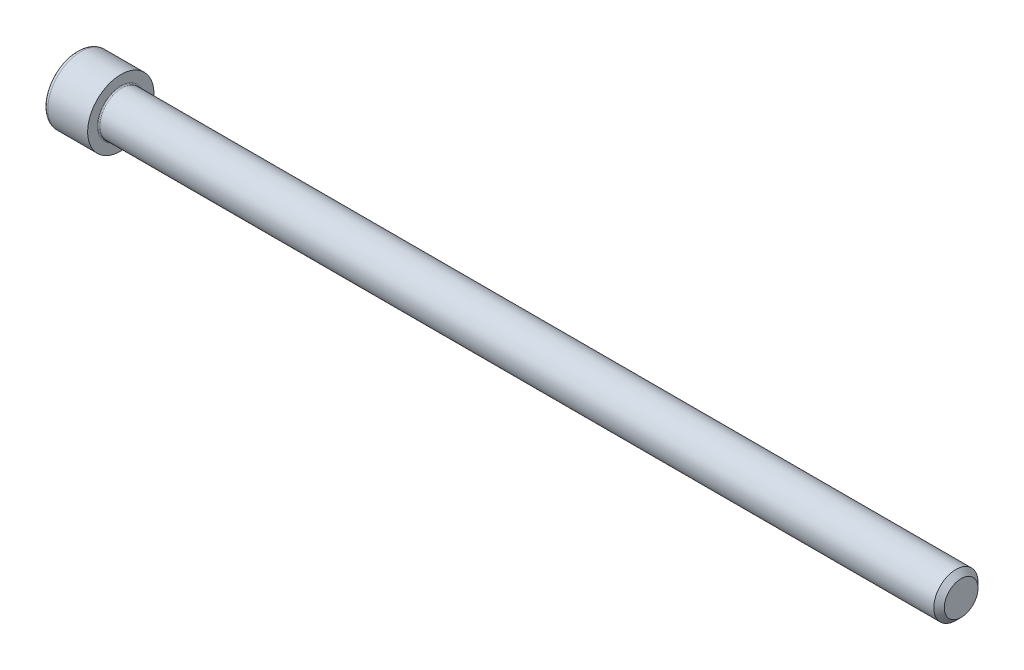
ISO-10303-21;
HEADER;
FILE_DESCRIPTION(('STEP AP214'),'2;1');
FILE_NAME('part.step','',(''),(''),'','','');
FILE_SCHEMA(('AUTOMOTIVE_DESIGN { 1 0 10303 214 1 1 1 1 }'));
ENDSEC;
DATA;
#1=APPLICATION_CONTEXT('core data for automotive mechanical design processes');
#2=APPLICATION_PROTOCOL_DEFINITION('international standard','automotive_design',2000,#1);
#3=PRODUCT_CONTEXT('',#1,'mechanical');
#4=PRODUCT('Part','Part','',(#3));
#5=PRODUCT_RELATED_PRODUCT_CATEGORY('part','',(#4));
#6=PRODUCT_DEFINITION_FORMATION('','',#4);
#7=PRODUCT_DEFINITION_CONTEXT('part definition',#1,'design');
#8=PRODUCT_DEFINITION('design','',#6,#7);
#9=PRODUCT_DEFINITION_SHAPE('','',#8);
#10=(LENGTH_UNIT() NAMED_UNIT(*) SI_UNIT(.MILLI.,.METRE.));
#11=(NAMED_UNIT(*) PLANE_ANGLE_UNIT() SI_UNIT($,.RADIAN.));
#12=(NAMED_UNIT(*) SI_UNIT($,.STERADIAN.) SOLID_ANGLE_UNIT());
#13=UNCERTAINTY_MEASURE_WITH_UNIT(LENGTH_MEASURE(1.E-05),#10,'distance_accuracy_value','');
#14=(GEOMETRIC_REPRESENTATION_CONTEXT(3) GLOBAL_UNCERTAINTY_ASSIGNED_CONTEXT((#13)) GLOBAL_UNIT_ASSIGNED_CONTEXT((#10,
#11,#12)) REPRESENTATION_CONTEXT('',''));
#15=CARTESIAN_POINT('',(0.,0.,0.));
#16=DIRECTION('',(0.,0.,1.));
#17=DIRECTION('',(1.,0.,0.));
#18=AXIS2_PLACEMENT_3D('',#15,#16,#17);
#19=CARTESIAN_POINT('',(-3.302,0.,0.));
#20=DIRECTION('',(-1.,0.,0.));
#21=DIRECTION('',(0.,-1.,0.));
#22=AXIS2_PLACEMENT_3D('',#19,#20,#21);
#23=CONICAL_SURFACE('',#22,2.7569630054343,1.0471975511966);
#24=CARTESIAN_POINT('',(-1.71026666666666,0.,0.));
#25=VERTEX_POINT('',#24);
#26=VERTEX_LOOP('',#25);
#27=FACE_BOUND('',#26,.T.);
#28=CARTESIAN_POINT('',(-3.30206667085494,0.000200000000433414,2.75707847548839));
#29=CARTESIAN_POINT('',(-3.26707753696983,-0.104723935463937,2.6965006131036));
#30=CARTESIAN_POINT('',(-3.2352559146133,-0.210553565393113,2.63539984777575));
#31=CARTESIAN_POINT('',(-3.17971030909145,-0.424045469620166,2.51214023940046));
#32=CARTESIAN_POINT('',(-3.15600597703146,-0.5317115380593,2.44997920580453));
#33=CARTESIAN_POINT('',(-3.11910584905482,-0.745709321959359,2.32642752766385));
#34=CARTESIAN_POINT('',(-3.10566447822797,-0.852008106597724,2.26505589573836));
#35=CARTESIAN_POINT('',(-3.08961674760199,-1.0651059825394,2.1420237796997));
#36=CARTESIAN_POINT('',(-3.08699710051457,-1.17190429901672,2.08036374293251));
#37=CARTESIAN_POINT('',(-3.09243976092168,-1.3714718573095,1.96514335943066));
#38=CARTESIAN_POINT('',(-3.09916570852556,-1.46427093659275,1.91156578602593));
#39=CARTESIAN_POINT('',(-3.1204852251421,-1.64926449459375,1.80475970551571));
#40=CARTESIAN_POINT('',(-3.13508608064024,-1.74145833320265,1.75153156797723));
#41=CARTESIAN_POINT('',(-3.1715879595363,-1.92683347580797,1.64450517949299));
#42=CARTESIAN_POINT('',(-3.19364375098414,-2.0199913112977,1.59072047809587));
#43=CARTESIAN_POINT('',(-3.24370205803596,-2.20491735878384,1.48395337479957));
#44=CARTESIAN_POINT('',(-3.27169280762564,-2.29668794093022,1.43096960449367));
#45=CARTESIAN_POINT('',(-3.30206667085479,-2.3878,1.37836603266331));
#46=B_SPLINE_CURVE_WITH_KNOTS('',3,(#28,#29,#30,#31,#32,#33,#34,#35,#36,#37,#38,#39,#40,#41,#42,
#43,#44,#45),.UNSPECIFIED.,.F.,.F.,(4,2,2,2,2,2,2,2,4),(0.,0.378469527554682,0.757848917720178,
1.12783830118156,1.49737326355518,1.81916504067634,2.14125507699924,2.4704906802841,
2.7990795790434),.UNSPECIFIED.);
#47=CARTESIAN_POINT('',(-3.30200000001923,0.,2.7569630054343));
#48=VERTEX_POINT('',#47);
#49=CARTESIAN_POINT('',(-3.30200000001923,-2.3876,1.37848150271715));
#50=VERTEX_POINT('',#49);
#51=EDGE_CURVE('E132',#48,#50,#46,.T.);
#52=ORIENTED_EDGE('',*,*,#51,.F.);
#53=CARTESIAN_POINT('',(-3.30206667085494,2.38780000000044,1.37836603266306));
#54=CARTESIAN_POINT('',(-3.26707753696983,2.28287606453606,1.43894389504785));
#55=CARTESIAN_POINT('',(-3.2352559146133,2.17704643460689,1.5000446603757));
#56=CARTESIAN_POINT('',(-3.17971030909145,1.96355453037984,1.62330426875099));
#57=CARTESIAN_POINT('',(-3.15600597703146,1.8558884619407,1.68546530234691));
#58=CARTESIAN_POINT('',(-3.11910584905482,1.64189067804064,1.8090169804876));
#59=CARTESIAN_POINT('',(-3.10566447822797,1.53559189340228,1.87038861241309));
#60=CARTESIAN_POINT('',(-3.08961674760199,1.3224940174606,1.99342072845175));
#61=CARTESIAN_POINT('',(-3.08699710051457,1.21569570098328,2.05508076521893));
#62=CARTESIAN_POINT('',(-3.09243976092168,1.0161281426905,2.17030114872078));
#63=CARTESIAN_POINT('',(-3.09916570852556,0.923329063407248,2.22387872212552));
#64=CARTESIAN_POINT('',(-3.1204852251421,0.738335505406253,2.33068480263574));
#65=CARTESIAN_POINT('',(-3.13508608064024,0.646141666797352,2.38391294017421));
#66=CARTESIAN_POINT('',(-3.1715879595363,0.460766524192034,2.49093932865846));
#67=CARTESIAN_POINT('',(-3.19364375098414,0.367608688702303,2.54472403005558));
#68=CARTESIAN_POINT('',(-3.24370205803596,0.182682641216162,2.65149113335188));
#69=CARTESIAN_POINT('',(-3.27169280762564,0.0909120590697815,2.70447490365778));
#70=CARTESIAN_POINT('',(-3.30206667085479,-0.000199999999999891,2.75707847548814));
#71=B_SPLINE_CURVE_WITH_KNOTS('',3,(#53,#54,#55,#56,#57,#58,#59,#60,#61,#62,#63,#64,#65,#66,#67,
#68,#69,#70),.UNSPECIFIED.,.F.,.F.,(4,2,2,2,2,2,2,2,4),(0.,0.378469527554682,0.757848917720177,
1.12783830118156,1.49737326355518,1.81916504067634,2.14125507699925,2.4704906802841,
2.7990795790434),.UNSPECIFIED.);
#72=CARTESIAN_POINT('',(-3.30200000001923,2.3876,1.37848150271715));
#73=VERTEX_POINT('',#72);
#74=EDGE_CURVE('E116',#73,#48,#71,.T.);
#75=ORIENTED_EDGE('',*,*,#74,.F.);
#76=CARTESIAN_POINT('',(-4.18979393601053,2.3876,-3.56980849321914));
#77=CARTESIAN_POINT('',(-4.14032815892821,2.3876,-3.46670370248886));
#78=CARTESIAN_POINT('',(-4.09137617294275,2.3876,-3.36334773439771));
#79=CARTESIAN_POINT('',(-3.99479124822564,2.3876,-3.15599957257145));
#80=CARTESIAN_POINT('',(-3.94715854687755,2.3876,-3.05200726839555));
#81=CARTESIAN_POINT('',(-3.85323755548223,2.3876,-2.84265630190437));
#82=CARTESIAN_POINT('',(-3.80695917341202,2.3876,-2.73729317779474));
#83=CARTESIAN_POINT('',(-3.71647764771049,2.3876,-2.52568279122073));
#84=CARTESIAN_POINT('',(-3.67227439617583,2.3876,-2.41943557506662));
#85=CARTESIAN_POINT('',(-3.58537011973026,2.3876,-2.20308925723331));
#86=CARTESIAN_POINT('',(-3.54273858869362,2.3876,-2.09296207559752));
#87=CARTESIAN_POINT('',(-3.46101994745047,2.3876,-1.87137563995219));
#88=CARTESIAN_POINT('',(-3.42193324834409,2.3876,-1.75991623313437));
#89=CARTESIAN_POINT('',(-3.34842202238522,2.3876,-1.53574546818941));
#90=CARTESIAN_POINT('',(-3.3139867136315,2.3876,-1.42303768420965));
#91=CARTESIAN_POINT('',(-3.2509559036791,2.3876,-1.19600683622335));
#92=CARTESIAN_POINT('',(-3.22235895212225,2.3876,-1.08168418094485));
#93=CARTESIAN_POINT('',(-3.17252928890006,2.3876,-0.851661734027278));
#94=CARTESIAN_POINT('',(-3.15128145205012,2.3876,-0.735965283877569));
#95=CARTESIAN_POINT('',(-3.11754136315291,2.3876,-0.503277987562836));
#96=CARTESIAN_POINT('',(-3.10504851942715,2.3876,-0.386287229412427));
#97=CARTESIAN_POINT('',(-3.08997750794679,2.3876,-0.153060820709615));
#98=CARTESIAN_POINT('',(-3.08728234032656,2.3876,-0.0368329177291767));
#99=CARTESIAN_POINT('',(-3.09173437046107,2.3876,0.195441211734909));
#100=CARTESIAN_POINT('',(-3.09888217765583,2.3876,0.311487426523711));
#101=CARTESIAN_POINT('',(-3.11929953408256,2.3876,0.512427197188799));
#102=CARTESIAN_POINT('',(-3.13048322640562,2.3876,0.597542928135908));
#103=CARTESIAN_POINT('',(-3.15737658155533,2.3876,0.767062617315265));
#104=CARTESIAN_POINT('',(-3.17308702751811,2.3876,0.851466449785063));
#105=CARTESIAN_POINT('',(-3.22617759497026,2.3876,1.10356659989914));
#106=CARTESIAN_POINT('',(-3.26950195890938,2.3876,1.27002026330531));
#107=CARTESIAN_POINT('',(-3.34351951443674,2.3876,1.51891846693128));
#108=CARTESIAN_POINT('',(-3.37004247651048,2.3876,1.60267504477746));
#109=CARTESIAN_POINT('',(-3.42554115129613,2.3876,1.76932116385019));
#110=CARTESIAN_POINT('',(-3.45451533329899,2.3876,1.85221121038454));
#111=CARTESIAN_POINT('',(-3.51449661718129,2.3876,2.01722886079908));
#112=CARTESIAN_POINT('',(-3.54550334960868,2.3876,2.09935660016092));
#113=CARTESIAN_POINT('',(-3.60921387627046,2.3876,2.26296537207273));
#114=CARTESIAN_POINT('',(-3.64191795723009,2.3876,2.34444629266072));
#115=CARTESIAN_POINT('',(-3.72749222624701,2.3876,2.55242893230761));
#116=CARTESIAN_POINT('',(-3.78137257985246,2.3876,2.67851448309363));
#117=CARTESIAN_POINT('',(-3.8917254000684,2.3876,2.92954963732602));
#118=CARTESIAN_POINT('',(-3.94819806086299,2.3876,3.05449915483192));
#119=CARTESIAN_POINT('',(-4.06314681218863,2.3876,3.30349712860239));
#120=CARTESIAN_POINT('',(-4.12162325025623,2.3876,3.42754542399003));
#121=CARTESIAN_POINT('',(-4.24013780231263,2.3876,3.6748949368526));
#122=CARTESIAN_POINT('',(-4.30017595103082,2.3876,3.7981961376383));
#123=CARTESIAN_POINT('',(-4.48227324944979,2.3876,4.16748745488008));
#124=CARTESIAN_POINT('',(-4.60617582250528,2.3876,4.41256771633377));
#125=CARTESIAN_POINT('',(-4.85714973382895,2.3876,4.90105019175774));
#126=CARTESIAN_POINT('',(-4.98422066930818,2.3876,5.14445261405767));
#127=CARTESIAN_POINT('',(-5.22846408211094,2.38760000000001,5.60717601476413));
#128=CARTESIAN_POINT('',(-5.34543879972904,2.38760000000001,5.82660154635426));
#129=CARTESIAN_POINT('',(-5.58072000325182,2.38760000000001,6.26474684956248));
#130=CARTESIAN_POINT('',(-5.69902653844135,2.38760000000001,6.48346659467455));
#131=CARTESIAN_POINT('',(-5.93633623854323,2.38760000000001,6.91980663495285));
#132=CARTESIAN_POINT('',(-6.05533686617889,2.38760000000001,7.13742831158591));
#133=CARTESIAN_POINT('',(-6.29411264362597,2.38760000000001,7.57223168560479));
#134=CARTESIAN_POINT('',(-6.41388775257905,2.38760000000001,7.78941340541968));
#135=CARTESIAN_POINT('',(-6.53394673725325,2.38760000000001,8.00643706714308));
#136=B_SPLINE_CURVE_WITH_KNOTS('',3,(#76,#77,#78,#79,#80,#81,#82,#83,#84,#85,#86,#87,#88,#89,
#90,#91,#92,#93,#94,#95,#96,#97,#98,#99,#100,#101,#102,#103,#104,#105,#106,#107,#108,#109,#110,
#111,#112,#113,#114,#115,#116,#117,#118,#119,#120,#121,#122,#123,#124,#125,#126,#127,#128,#129,
#130,#131,#132,#133,#134,#135),.UNSPECIFIED.,.F.,.F.,(4,2,2,2,2,2,2,2,2,2,2,2,2,2,2,2,2,2,2,2,2,
2,2,2,2,2,2,2,2,4),(0.,0.343075057157597,0.686211449189028,1.03142931875567,1.37662921763736,
1.73085459772213,2.08512100552917,2.4385515920946,2.79189427270901,3.14450535144263,
3.49709259777493,3.84545529792506,4.19383956835466,4.4512543032807,4.70871359816253,
5.22402691449442,5.4875755508175,5.75096080731955,6.01429832092988,6.27768046464175,
6.68898487147715,7.10032013867146,7.51172711288515,7.92314324382323,8.74696114416904,
9.57067484251388,10.3166417000106,11.0626362538742,11.8067333547366,12.5507915153776),.UNSPECIFIED.);
#137=CARTESIAN_POINT('',(-3.30200000001923,2.3876,-1.37848150271715));
#138=VERTEX_POINT('',#137);
#139=EDGE_CURVE('E124',#138,#73,#136,.T.);
#140=ORIENTED_EDGE('',*,*,#139,.F.);
#141=CARTESIAN_POINT('',(-3.30206667085479,-0.000200000000000576,-2.75707847548814));
#142=CARTESIAN_POINT('',(-3.2670775369697,0.104723935464364,-2.69650061310335));
#143=CARTESIAN_POINT('',(-3.23525591461318,0.210553565393532,-2.63539984777551));
#144=CARTESIAN_POINT('',(-3.17971030909135,0.42404546962057,-2.51214023940022));
#145=CARTESIAN_POINT('',(-3.15600597703138,0.531711538059696,-2.44997920580431));
#146=CARTESIAN_POINT('',(-3.11910584905476,0.74570932195974,-2.32642752766363));
#147=CARTESIAN_POINT('',(-3.10566447822793,0.852008106598096,-2.26505589573815));
#148=CARTESIAN_POINT('',(-3.08961674760197,1.06510598253976,-2.14202377969949));
#149=CARTESIAN_POINT('',(-3.08699710051457,1.17190429901707,-2.08036374293232));
#150=CARTESIAN_POINT('',(-3.0924397609217,1.37147185730985,-1.96514335943047));
#151=CARTESIAN_POINT('',(-3.09916570852559,1.46427093659311,-1.91156578602572));
#152=CARTESIAN_POINT('',(-3.12048522514215,1.64926449459412,-1.80475970551549));
#153=CARTESIAN_POINT('',(-3.1350860806403,1.74145833320303,-1.75153156797702));
#154=CARTESIAN_POINT('',(-3.17158795953639,1.92683347580836,-1.64450517949276));
#155=CARTESIAN_POINT('',(-3.19364375098424,2.0199913112981,-1.59072047809564));
#156=CARTESIAN_POINT('',(-3.24370205803608,2.20491735878426,-1.48395337479933));
#157=CARTESIAN_POINT('',(-3.27169280762577,2.29668794093064,-1.43096960449343));
#158=CARTESIAN_POINT('',(-3.30206667085494,2.38780000000043,-1.37836603266306));
#159=B_SPLINE_CURVE_WITH_KNOTS('',3,(#141,#142,#143,#144,#145,#146,#147,#148,#149,#150,#151,
#152,#153,#154,#155,#156,#157,#158),.UNSPECIFIED.,.F.,.F.,(4,2,2,2,2,2,2,2,4),(0.,
0.378469527554649,0.757848917720111,1.12783830118146,1.49737326355505,1.81916504067624,
2.14125507699918,2.47049068028407,2.7990795790434),.UNSPECIFIED.);
#160=CARTESIAN_POINT('',(-3.30200000001923,0.,-2.7569630054343));
#161=VERTEX_POINT('',#160);
#162=EDGE_CURVE('E161',#161,#138,#159,.T.);
#163=ORIENTED_EDGE('',*,*,#162,.F.);
#164=CARTESIAN_POINT('',(-3.30206667085479,-2.3878,-1.37836603266331));
#165=CARTESIAN_POINT('',(-3.2670775369697,-2.28287606453564,-1.4389438950481));
#166=CARTESIAN_POINT('',(-3.23525591461318,-2.17704643460647,-1.50004466037594));
#167=CARTESIAN_POINT('',(-3.17971030909135,-1.96355453037943,-1.62330426875123));
#168=CARTESIAN_POINT('',(-3.15600597703138,-1.8558884619403,-1.68546530234715));
#169=CARTESIAN_POINT('',(-3.11910584905476,-1.64189067804026,-1.80901698048782));
#170=CARTESIAN_POINT('',(-3.10566447822793,-1.5355918934019,-1.8703886124133));
#171=CARTESIAN_POINT('',(-3.08961674760197,-1.32249401746024,-1.99342072845196));
#172=CARTESIAN_POINT('',(-3.08699710051457,-1.21569570098293,-2.05508076521914));
#173=CARTESIAN_POINT('',(-3.0924397609217,-1.01612814269015,-2.17030114872099));
#174=CARTESIAN_POINT('',(-3.09916570852559,-0.923329063406891,-2.22387872212573));
#175=CARTESIAN_POINT('',(-3.12048522514215,-0.73833550540588,-2.33068480263596));
#176=CARTESIAN_POINT('',(-3.1350860806403,-0.646141666796972,-2.38391294017444));
#177=CARTESIAN_POINT('',(-3.17158795953639,-0.460766524191638,-2.49093932865869));
#178=CARTESIAN_POINT('',(-3.19364375098424,-0.3676086887019,-2.54472403005581));
#179=CARTESIAN_POINT('',(-3.24370205803608,-0.182682641215744,-2.65149113335212));
#180=CARTESIAN_POINT('',(-3.27169280762577,-0.0909120590693554,-2.70447490365803));
#181=CARTESIAN_POINT('',(-3.30206667085494,0.000200000000432987,-2.75707847548839));
#182=B_SPLINE_CURVE_WITH_KNOTS('',3,(#164,#165,#166,#167,#168,#169,#170,#171,#172,#173,#174,
#175,#176,#177,#178,#179,#180,#181),.UNSPECIFIED.,.F.,.F.,(4,2,2,2,2,2,2,2,4),(0.,
0.378469527554649,0.75784891772011,1.12783830118146,1.49737326355505,1.81916504067624,
2.14125507699918,2.47049068028407,2.7990795790434),.UNSPECIFIED.);
#183=CARTESIAN_POINT('',(-3.30200000001923,-2.3876,-1.37848150271715));
#184=VERTEX_POINT('',#183);
#185=EDGE_CURVE('E171',#184,#161,#182,.T.);
#186=ORIENTED_EDGE('',*,*,#185,.F.);
#187=CARTESIAN_POINT('',(-4.18979393539434,-2.3876,-3.56980849193515));
#188=CARTESIAN_POINT('',(-4.14032815833857,-2.3876,-3.46670370124875));
#189=CARTESIAN_POINT('',(-4.09137617237963,-2.3876,-3.36334773320152));
#190=CARTESIAN_POINT('',(-3.99479124771543,-2.3876,-3.15599957146324));
#191=CARTESIAN_POINT('',(-3.94715854639372,-2.3876,-3.05200726733141));
#192=CARTESIAN_POINT('',(-3.8532375550512,-2.3876,-2.84265630092922));
#193=CARTESIAN_POINT('',(-3.8069591730074,-2.3876,-2.73729317686451));
#194=CARTESIAN_POINT('',(-3.71647764735818,-2.3876,-2.52568279038068));
#195=CARTESIAN_POINT('',(-3.67227439584941,-2.3876,-2.41943557427184));
#196=CARTESIAN_POINT('',(-3.58537011945579,-2.3876,-2.2030892565317));
#197=CARTESIAN_POINT('',(-3.54273858844516,-2.3876,-2.09296207494383));
#198=CARTESIAN_POINT('',(-3.46101994725245,-2.3876,-1.87137563939521));
#199=CARTESIAN_POINT('',(-3.42193324817049,-2.3876,-1.75991623262616));
#200=CARTESIAN_POINT('',(-3.34842202225778,-2.3876,-1.53574546777968));
#201=CARTESIAN_POINT('',(-3.31398671352581,-2.3876,-1.4230376838496));
#202=CARTESIAN_POINT('',(-3.25095590361285,-2.3876,-1.19600683596409));
#203=CARTESIAN_POINT('',(-3.22235895207369,-2.3876,-1.08168418073668));
#204=CARTESIAN_POINT('',(-3.17252928888399,-2.3876,-0.851661733937182));
#205=CARTESIAN_POINT('',(-3.15128145204795,-2.3876,-0.735965283854639));
#206=CARTESIAN_POINT('',(-3.11754136316811,-2.3876,-0.503277987675645));
#207=CARTESIAN_POINT('',(-3.10504851944584,-2.3876,-0.386287229593808));
#208=CARTESIAN_POINT('',(-3.08997750796041,-2.3876,-0.153060821026864));
#209=CARTESIAN_POINT('',(-3.08728234033184,-2.3876,-0.0368329181137151));
#210=CARTESIAN_POINT('',(-3.0917343704385,-2.3876,0.195441211217051));
#211=CARTESIAN_POINT('',(-3.09888217761376,-2.3876,0.311487425939823));
#212=CARTESIAN_POINT('',(-3.11929953400169,-2.3876,0.512427196518833));
#213=CARTESIAN_POINT('',(-3.130483226309,-2.3876,0.597542927445186));
#214=CARTESIAN_POINT('',(-3.15737658142634,-2.3876,0.767062616583859));
#215=CARTESIAN_POINT('',(-3.17308702737249,-2.3876,0.851466449033728));
#216=CARTESIAN_POINT('',(-3.22617759477434,-2.3876,1.10356659908891));
#217=CARTESIAN_POINT('',(-3.26950195867939,-2.3876,1.27002026245713));
#218=CARTESIAN_POINT('',(-3.34351951415623,-2.3876,1.51891846602621));
#219=CARTESIAN_POINT('',(-3.37004247621298,-2.3876,1.60267504385305));
#220=CARTESIAN_POINT('',(-3.4255411509651,-2.3876,1.76932116288731));
#221=CARTESIAN_POINT('',(-3.45451533295141,-2.3876,1.85221120940253));
#222=CARTESIAN_POINT('',(-3.51449661680109,-2.3876,2.01722885977888));
#223=CARTESIAN_POINT('',(-3.54550334921242,-2.3876,2.09935659912167));
#224=CARTESIAN_POINT('',(-3.60921387584251,-2.3876,2.26296537099539));
#225=CARTESIAN_POINT('',(-3.64191795678652,-2.3876,2.34444629156432));
#226=CARTESIAN_POINT('',(-3.72749222577887,-2.3876,2.55242893119857));
#227=CARTESIAN_POINT('',(-3.78137257937665,-2.3876,2.67851448199057));
#228=CARTESIAN_POINT('',(-3.89172539957937,-2.3876,2.92954963623418));
#229=CARTESIAN_POINT('',(-3.94819806036842,-2.3876,3.05449915374532));
#230=CARTESIAN_POINT('',(-4.06314681168454,-2.3876,3.30349712752571));
#231=CARTESIAN_POINT('',(-4.12162324974816,-2.3876,3.42754542291804));
#232=CARTESIAN_POINT('',(-4.24013780179773,-2.3876,3.67489493578953));
#233=CARTESIAN_POINT('',(-4.30017595051308,-2.3876,3.79819613657944));
#234=CARTESIAN_POINT('',(-4.48227324892495,-2.3876,4.1674874538337));
#235=CARTESIAN_POINT('',(-4.60617582197744,-2.3876,4.41256771529511));
#236=CARTESIAN_POINT('',(-4.85714973329697,-2.3876,4.90105019073352));
#237=CARTESIAN_POINT('',(-4.98422066877507,-2.3876,5.14445261304019));
#238=CARTESIAN_POINT('',(-5.22846408157354,-2.3876,5.60717601375278));
#239=CARTESIAN_POINT('',(-5.34543879918833,-2.3876,5.82660154534238));
#240=CARTESIAN_POINT('',(-5.58072000270508,-2.3876,6.26474684854927));
#241=CARTESIAN_POINT('',(-5.69902653789189,-2.3876,6.48346659366053));
#242=CARTESIAN_POINT('',(-5.93633623798831,-2.3876,6.91980663393625));
#243=CARTESIAN_POINT('',(-6.05533686562125,-2.3876,7.13742831056755));
#244=CARTESIAN_POINT('',(-6.29411264306314,-2.3876,7.57223168458273));
#245=CARTESIAN_POINT('',(-6.41388775201376,-2.3876,7.78941340439569));
#246=CARTESIAN_POINT('',(-6.5339467366856,-2.3876,8.0064370661171));
#247=B_SPLINE_CURVE_WITH_KNOTS('',3,(#187,#188,#189,#190,#191,#192,#193,#194,#195,#196,#197,
#198,#199,#200,#201,#202,#203,#204,#205,#206,#207,#208,#209,#210,#211,#212,#213,#214,#215,#216,
#217,#218,#219,#220,#221,#222,#223,#224,#225,#226,#227,#228,#229,#230,#231,#232,#233,#234,#235,
#236,#237,#238,#239,#240,#241,#242,#243,#244,#245,#246),.UNSPECIFIED.,.F.,.F.,(4,2,2,2,2,2,2,2,
2,2,2,2,2,2,2,2,2,2,2,2,2,2,2,2,2,2,2,2,2,4),(0.,0.34307505700446,0.686211448882729,
1.03142931829414,1.3766292170206,1.73085459694314,2.08512100458788,2.43855159099179,
2.79189427144482,3.1445053499732,3.49709259610054,3.84545529605019,4.19383956627912,
4.45125430113728,4.70871359595122,5.22402691214699,5.48757554839939,5.75096080483083,
6.01429831837067,6.27768046201202,6.68898486885481,7.10032013605656,7.51172711027787,
7.92314324122357,8.74696114158592,9.57067483994708,10.3166416974377,11.0626362512953,
11.8067333521491,12.5507915127815),.UNSPECIFIED.);
#248=EDGE_CURVE('E174',#50,#184,#247,.F.);
#249=ORIENTED_EDGE('',*,*,#248,.F.);
#250=EDGE_LOOP('',(#52,#75,#140,#163,#186,#249));
#251=FACE_BOUND('',#250,.T.);
#252=ADVANCED_FACE('F60',(#27,#251),#23,.F.);
#253=CARTESIAN_POINT('',(120.65,0.,0.));
#254=DIRECTION('',(-1.,0.,0.));
#255=DIRECTION('',(0.,-1.,0.));
#256=AXIS2_PLACEMENT_3D('',#253,#254,#255);
#257=PLANE('',#256);
#258=CARTESIAN_POINT('',(120.65,0.,0.));
#259=DIRECTION('',(-1.,0.,0.));
#260=DIRECTION('',(0.,-1.,0.));
#261=AXIS2_PLACEMENT_3D('',#258,#259,#260);
#262=CIRCLE('',#261,2.41935000000006);
#263=CARTESIAN_POINT('',(120.65,-2.41935000000005,0.));
#264=VERTEX_POINT('',#263);
#265=EDGE_CURVE('E247',#264,#264,#262,.F.);
#266=ORIENTED_EDGE('',*,*,#265,.T.);
#267=EDGE_LOOP('',(#266));
#268=FACE_BOUND('',#267,.T.);
#269=ADVANCED_FACE('F227',(#268),#257,.F.);
#270=CARTESIAN_POINT('',(-1.71026666666666,0.,0.));
#271=DIRECTION('',(-1.,0.,0.));
#272=DIRECTION('',(0.,-1.,0.));
#273=AXIS2_PLACEMENT_3D('',#270,#271,#272);
#274=CYLINDRICAL_SURFACE('',#273,3.17500000000001);
#275=CARTESIAN_POINT('',(0.177800000000001,0.,0.));
#276=DIRECTION('',(-1.,0.,0.));
#277=DIRECTION('',(0.,-1.,0.));
#278=AXIS2_PLACEMENT_3D('',#275,#276,#277);
#279=CIRCLE('',#278,3.17500000000001);
#280=CARTESIAN_POINT('',(0.177800000000001,-3.17500000000001,0.));
#281=VERTEX_POINT('',#280);
#282=EDGE_CURVE('E12',#281,#281,#279,.F.);
#283=ORIENTED_EDGE('',*,*,#282,.T.);
#284=EDGE_LOOP('',(#283));
#285=FACE_BOUND('',#284,.T.);
#286=CARTESIAN_POINT('',(119.89435,0.,0.));
#287=DIRECTION('',(-1.,0.,0.));
#288=DIRECTION('',(0.,-1.,0.));
#289=AXIS2_PLACEMENT_3D('',#286,#287,#288);
#290=CIRCLE('',#289,3.17500000000001);
#291=CARTESIAN_POINT('',(119.89435,-3.175,0.));
#292=VERTEX_POINT('',#291);
#293=EDGE_CURVE('E250',#292,#292,#290,.T.);
#294=ORIENTED_EDGE('',*,*,#293,.T.);
#295=EDGE_LOOP('',(#294));
#296=FACE_BOUND('',#295,.T.);
#297=ADVANCED_FACE('F223',(#285,#296),#274,.T.);
#298=CARTESIAN_POINT('',(0.,3.175,0.));
#299=DIRECTION('',(-1.,0.,0.));
#300=DIRECTION('',(0.,-1.,0.));
#301=AXIS2_PLACEMENT_3D('',#298,#299,#300);
#302=PLANE('',#301);
#303=CARTESIAN_POINT('',(0.,0.,0.));
#304=DIRECTION('',(-1.,0.,0.));
#305=DIRECTION('',(0.,-1.,0.));
#306=AXIS2_PLACEMENT_3D('',#303,#304,#305);
#307=CIRCLE('',#306,3.35280000000001);
#308=CARTESIAN_POINT('',(0.,-3.35280000000001,0.));
#309=VERTEX_POINT('',#308);
#310=EDGE_CURVE('E68',#309,#309,#307,.T.);
#311=ORIENTED_EDGE('',*,*,#310,.T.);
#312=EDGE_LOOP('',(#311));
#313=FACE_BOUND('',#312,.T.);
#314=CARTESIAN_POINT('',(0.,0.,0.));
#315=DIRECTION('',(-1.,0.,0.));
#316=DIRECTION('',(0.,-1.,0.));
#317=AXIS2_PLACEMENT_3D('',#314,#315,#316);
#318=CIRCLE('',#317,4.7625);
#319=CARTESIAN_POINT('',(0.,-4.7625,0.));
#320=VERTEX_POINT('',#319);
#321=EDGE_CURVE('E265',#320,#320,#318,.T.);
#322=ORIENTED_EDGE('',*,*,#321,.F.);
#323=EDGE_LOOP('',(#322));
#324=FACE_BOUND('',#323,.T.);
#325=ADVANCED_FACE('F219',(#313,#324),#302,.F.);
#326=CARTESIAN_POINT('',(-1.71026666666666,0.,0.));
#327=DIRECTION('',(-1.,0.,0.));
#328=DIRECTION('',(0.,-1.,0.));
#329=AXIS2_PLACEMENT_3D('',#326,#327,#328);
#330=CYLINDRICAL_SURFACE('',#329,4.7625);
#331=CARTESIAN_POINT('',(-5.715,0.,0.));
#332=DIRECTION('',(1.,0.,0.));
#333=DIRECTION('',(0.,1.,0.));
#334=AXIS2_PLACEMENT_3D('',#331,#332,#333);
#335=CIRCLE('',#334,4.7625);
#336=CARTESIAN_POINT('',(-5.715,4.7625,0.));
#337=VERTEX_POINT('',#336);
#338=EDGE_CURVE('E252',#337,#337,#335,.T.);
#339=ORIENTED_EDGE('',*,*,#338,.T.);
#340=EDGE_LOOP('',(#339));
#341=FACE_BOUND('',#340,.T.);
#342=ORIENTED_EDGE('',*,*,#321,.T.);
#343=EDGE_LOOP('',(#342));
#344=FACE_BOUND('',#343,.T.);
#345=ADVANCED_FACE('F215',(#341,#344),#330,.T.);
#346=CARTESIAN_POINT('',(-6.35,4.7625,0.));
#347=DIRECTION('',(1.,0.,0.));
#348=DIRECTION('',(0.,1.,0.));
#349=AXIS2_PLACEMENT_3D('',#346,#347,#348);
#350=PLANE('',#349);
#351=CARTESIAN_POINT('',(-6.35,0.,0.));
#352=DIRECTION('',(1.,0.,0.));
#353=DIRECTION('',(0.,1.,0.));
#354=AXIS2_PLACEMENT_3D('',#351,#352,#353);
#355=CIRCLE('',#354,4.1275);
#356=CARTESIAN_POINT('',(-6.35,4.1275,0.));
#357=VERTEX_POINT('',#356);
#358=EDGE_CURVE('E256',#357,#357,#355,.F.);
#359=ORIENTED_EDGE('',*,*,#358,.T.);
#360=EDGE_LOOP('',(#359));
#361=FACE_BOUND('',#360,.T.);
#362=DIRECTION('',(0.,0.,1.));
#363=VECTOR('',#362,1.);
#364=CARTESIAN_POINT('',(-6.35,2.3876,0.));
#365=LINE('',#364,#363);
#366=CARTESIAN_POINT('',(-6.35,2.3876,-1.37848150271715));
#367=VERTEX_POINT('',#366);
#368=CARTESIAN_POINT('',(-6.35,2.3876,1.37848150271715));
#369=VERTEX_POINT('',#368);
#370=EDGE_CURVE('E123',#367,#369,#365,.T.);
#371=ORIENTED_EDGE('',*,*,#370,.T.);
#372=DIRECTION('',(0.,-0.866025403784438,0.500000000000001));
#373=VECTOR('',#372,1.);
#374=CARTESIAN_POINT('',(-6.35,1.1938,2.06772225407572));
#375=LINE('',#374,#373);
#376=CARTESIAN_POINT('',(-6.35,0.,2.7569630054343));
#377=VERTEX_POINT('',#376);
#378=EDGE_CURVE('E119',#369,#377,#375,.T.);
#379=ORIENTED_EDGE('',*,*,#378,.T.);
#380=DIRECTION('',(0.,-0.866025403784439,-0.5));
#381=VECTOR('',#380,1.);
#382=CARTESIAN_POINT('',(-6.35,-1.1938,2.06772225407573));
#383=LINE('',#382,#381);
#384=CARTESIAN_POINT('',(-6.35,-2.3876,1.37848150271715));
#385=VERTEX_POINT('',#384);
#386=EDGE_CURVE('E205',#377,#385,#383,.T.);
#387=ORIENTED_EDGE('',*,*,#386,.T.);
#388=DIRECTION('',(0.,0.,-1.));
#389=VECTOR('',#388,1.);
#390=CARTESIAN_POINT('',(-6.35,-2.3876,0.));
#391=LINE('',#390,#389);
#392=CARTESIAN_POINT('',(-6.35,-2.3876,-1.37848150271715));
#393=VERTEX_POINT('',#392);
#394=EDGE_CURVE('E75',#385,#393,#391,.T.);
#395=ORIENTED_EDGE('',*,*,#394,.T.);
#396=DIRECTION('',(0.,0.866025403784439,-0.5));
#397=VECTOR('',#396,1.);
#398=CARTESIAN_POINT('',(-6.35,-1.1938,-2.06772225407573));
#399=LINE('',#398,#397);
#400=CARTESIAN_POINT('',(-6.35,0.,-2.7569630054343));
#401=VERTEX_POINT('',#400);
#402=EDGE_CURVE('E170',#393,#401,#399,.T.);
#403=ORIENTED_EDGE('',*,*,#402,.T.);
#404=DIRECTION('',(0.,0.866025403784439,0.5));
#405=VECTOR('',#404,1.);
#406=CARTESIAN_POINT('',(-6.35,1.1938,-2.06772225407573));
#407=LINE('',#406,#405);
#408=EDGE_CURVE('E166',#401,#367,#407,.T.);
#409=ORIENTED_EDGE('',*,*,#408,.T.);
#410=EDGE_LOOP('',(#371,#379,#387,#395,#403,#409));
#411=FACE_BOUND('',#410,.T.);
#412=ADVANCED_FACE('F211',(#361,#411),#350,.F.);
#413=CARTESIAN_POINT('',(500000.,-1.19379999999957,2.06772225407573));
#414=DIRECTION('',(0.,0.5,-0.866025403784439));
#415=DIRECTION('',(0.,0.866025403784439,0.5));
#416=AXIS2_PLACEMENT_3D('',#413,#414,#415);
#417=PLANE('',#416);
#418=DIRECTION('',(-1.,0.,0.));
#419=VECTOR('',#418,1.);
#420=CARTESIAN_POINT('',(500000.,4.33469536306741E-13,2.7569630054343));
#421=LINE('',#420,#419);
#422=EDGE_CURVE('E270',#48,#377,#421,.T.);
#423=ORIENTED_EDGE('',*,*,#422,.F.);
#424=ORIENTED_EDGE('',*,*,#51,.T.);
#425=DIRECTION('',(-1.,0.,0.));
#426=VECTOR('',#425,1.);
#427=CARTESIAN_POINT('',(500000.,-2.38759999999957,1.37848150271715));
#428=LINE('',#427,#426);
#429=EDGE_CURVE('E204',#50,#385,#428,.T.);
#430=ORIENTED_EDGE('',*,*,#429,.T.);
#431=ORIENTED_EDGE('',*,*,#386,.F.);
#432=EDGE_LOOP('',(#423,#424,#430,#431));
#433=FACE_BOUND('',#432,.T.);
#434=ADVANCED_FACE('F190',(#433),#417,.T.);
#435=CARTESIAN_POINT('',(500000.,-2.38759999999957,0.));
#436=DIRECTION('',(0.,1.,0.));
#437=DIRECTION('',(0.,0.,1.));
#438=AXIS2_PLACEMENT_3D('',#435,#436,#437);
#439=PLANE('',#438);
#440=ORIENTED_EDGE('',*,*,#429,.F.);
#441=ORIENTED_EDGE('',*,*,#248,.T.);
#442=DIRECTION('',(-1.,0.,0.));
#443=VECTOR('',#442,1.);
#444=CARTESIAN_POINT('',(500000.,-2.38759999999957,-1.37848150271715));
#445=LINE('',#444,#443);
#446=EDGE_CURVE('E181',#184,#393,#445,.T.);
#447=ORIENTED_EDGE('',*,*,#446,.T.);
#448=ORIENTED_EDGE('',*,*,#394,.F.);
#449=EDGE_LOOP('',(#440,#441,#447,#448));
#450=FACE_BOUND('',#449,.T.);
#451=ADVANCED_FACE('F186',(#450),#439,.T.);
#452=CARTESIAN_POINT('',(500000.,-1.19379999999957,-2.06772225407573));
#453=DIRECTION('',(0.,0.5,0.866025403784439));
#454=DIRECTION('',(0.,-0.866025403784439,0.5));
#455=AXIS2_PLACEMENT_3D('',#452,#453,#454);
#456=PLANE('',#455);
#457=ORIENTED_EDGE('',*,*,#446,.F.);
#458=ORIENTED_EDGE('',*,*,#185,.T.);
#459=DIRECTION('',(-1.,0.,0.));
#460=VECTOR('',#459,1.);
#461=CARTESIAN_POINT('',(500000.,4.33252695872244E-13,-2.7569630054343));
#462=LINE('',#461,#460);
#463=EDGE_CURVE('E167',#161,#401,#462,.T.);
#464=ORIENTED_EDGE('',*,*,#463,.T.);
#465=ORIENTED_EDGE('',*,*,#402,.F.);
#466=EDGE_LOOP('',(#457,#458,#464,#465));
#467=FACE_BOUND('',#466,.T.);
#468=ADVANCED_FACE('F156',(#467),#456,.T.);
#469=CARTESIAN_POINT('',(500000.,1.19380000000043,-2.06772225407573));
#470=DIRECTION('',(0.,-0.5,0.866025403784439));
#471=DIRECTION('',(0.,-0.866025403784439,-0.5));
#472=AXIS2_PLACEMENT_3D('',#469,#470,#471);
#473=PLANE('',#472);
#474=ORIENTED_EDGE('',*,*,#463,.F.);
#475=ORIENTED_EDGE('',*,*,#162,.T.);
#476=DIRECTION('',(-1.,0.,0.));
#477=VECTOR('',#476,1.);
#478=CARTESIAN_POINT('',(500000.,2.38760000000043,-1.37848150271715));
#479=LINE('',#478,#477);
#480=EDGE_CURVE('E137',#138,#367,#479,.T.);
#481=ORIENTED_EDGE('',*,*,#480,.T.);
#482=ORIENTED_EDGE('',*,*,#408,.F.);
#483=EDGE_LOOP('',(#474,#475,#481,#482));
#484=FACE_BOUND('',#483,.T.);
#485=ADVANCED_FACE('F152',(#484),#473,.T.);
#486=CARTESIAN_POINT('',(500000.,2.38760000000043,0.));
#487=DIRECTION('',(0.,-1.,0.));
#488=DIRECTION('',(0.,0.,-1.));
#489=AXIS2_PLACEMENT_3D('',#486,#487,#488);
#490=PLANE('',#489);
#491=ORIENTED_EDGE('',*,*,#480,.F.);
#492=ORIENTED_EDGE('',*,*,#139,.T.);
#493=DIRECTION('',(-1.,0.,0.));
#494=VECTOR('',#493,1.);
#495=CARTESIAN_POINT('',(500000.,2.38760000000044,1.37848150271715));
#496=LINE('',#495,#494);
#497=EDGE_CURVE('E113',#73,#369,#496,.T.);
#498=ORIENTED_EDGE('',*,*,#497,.T.);
#499=ORIENTED_EDGE('',*,*,#370,.F.);
#500=EDGE_LOOP('',(#491,#492,#498,#499));
#501=FACE_BOUND('',#500,.T.);
#502=ADVANCED_FACE('F135',(#501),#490,.T.);
#503=CARTESIAN_POINT('',(500000.,1.19380000000043,2.06772225407572));
#504=DIRECTION('',(0.,-0.500000000000001,-0.866025403784438));
#505=DIRECTION('',(0.,0.866025403784438,-0.500000000000001));
#506=AXIS2_PLACEMENT_3D('',#503,#504,#505);
#507=PLANE('',#506);
#508=ORIENTED_EDGE('',*,*,#497,.F.);
#509=ORIENTED_EDGE('',*,*,#74,.T.);
#510=ORIENTED_EDGE('',*,*,#422,.T.);
#511=ORIENTED_EDGE('',*,*,#378,.F.);
#512=EDGE_LOOP('',(#508,#509,#510,#511));
#513=FACE_BOUND('',#512,.T.);
#514=ADVANCED_FACE('F115',(#513),#507,.T.);
#515=CARTESIAN_POINT('',(-5.715,0.,0.));
#516=DIRECTION('',(1.,0.,0.));
#517=DIRECTION('',(0.,1.,0.));
#518=AXIS2_PLACEMENT_3D('',#515,#516,#517);
#519=TOROIDAL_SURFACE('',#518,4.1275,0.635);
#520=ORIENTED_EDGE('',*,*,#338,.F.);
#521=EDGE_LOOP('',(#520));
#522=FACE_BOUND('',#521,.T.);
#523=ORIENTED_EDGE('',*,*,#358,.F.);
#524=EDGE_LOOP('',(#523));
#525=FACE_BOUND('',#524,.T.);
#526=ADVANCED_FACE('F234',(#522,#525),#519,.T.);
#527=CARTESIAN_POINT('',(119.89435,0.,0.));
#528=DIRECTION('',(-1.,0.,0.));
#529=DIRECTION('',(0.,-1.,0.));
#530=AXIS2_PLACEMENT_3D('',#527,#528,#529);
#531=CONICAL_SURFACE('',#530,3.17500000000001,0.785398163397455);
#532=CARTESIAN_POINT('',(120.65,-2.41935000000005,0.));
#533=CARTESIAN_POINT('',(120.642128645833,-2.42722135416671,0.));
#534=CARTESIAN_POINT('',(120.634257291667,-2.43509270833338,0.));
#535=CARTESIAN_POINT('',(120.618514583333,-2.45083541666671,0.));
#536=CARTESIAN_POINT('',(120.610643229167,-2.45870677083338,0.));
#537=CARTESIAN_POINT('',(120.594900520833,-2.47444947916671,0.));
#538=CARTESIAN_POINT('',(120.587029166667,-2.48232083333338,0.));
#539=CARTESIAN_POINT('',(120.571286458333,-2.49806354166671,0.));
#540=CARTESIAN_POINT('',(120.563415104167,-2.50593489583338,0.));
#541=CARTESIAN_POINT('',(120.547672395833,-2.52167760416671,0.));
#542=CARTESIAN_POINT('',(120.539801041667,-2.52954895833338,0.));
#543=CARTESIAN_POINT('',(120.524058333333,-2.54529166666671,0.));
#544=CARTESIAN_POINT('',(120.516186979167,-2.55316302083337,0.));
#545=CARTESIAN_POINT('',(120.500444270833,-2.56890572916671,0.));
#546=CARTESIAN_POINT('',(120.492572916667,-2.57677708333337,0.));
#547=CARTESIAN_POINT('',(120.476830208333,-2.5925197916667,0.));
#548=CARTESIAN_POINT('',(120.468958854167,-2.60039114583337,0.));
#549=CARTESIAN_POINT('',(120.453216145833,-2.6161338541667,0.));
#550=CARTESIAN_POINT('',(120.445344791667,-2.62400520833337,0.));
#551=CARTESIAN_POINT('',(120.429602083333,-2.6397479166667,0.));
#552=CARTESIAN_POINT('',(120.421730729167,-2.64761927083337,0.));
#553=CARTESIAN_POINT('',(120.405988020833,-2.6633619791667,0.));
#554=CARTESIAN_POINT('',(120.398116666667,-2.67123333333337,0.));
#555=CARTESIAN_POINT('',(120.382373958333,-2.6869760416667,0.));
#556=CARTESIAN_POINT('',(120.374502604167,-2.69484739583336,0.));
#557=CARTESIAN_POINT('',(120.358759895833,-2.7105901041667,0.));
#558=CARTESIAN_POINT('',(120.350888541667,-2.71846145833336,0.));
#559=CARTESIAN_POINT('',(120.335145833333,-2.73420416666669,0.));
#560=CARTESIAN_POINT('',(120.327274479167,-2.74207552083336,0.));
#561=CARTESIAN_POINT('',(120.311531770833,-2.75781822916669,0.));
#562=CARTESIAN_POINT('',(120.303660416667,-2.76568958333336,0.));
#563=CARTESIAN_POINT('',(120.287917708333,-2.78143229166669,0.));
#564=CARTESIAN_POINT('',(120.280046354167,-2.78930364583336,0.));
#565=CARTESIAN_POINT('',(120.264303645833,-2.80504635416669,0.));
#566=CARTESIAN_POINT('',(120.256432291667,-2.81291770833336,0.));
#567=CARTESIAN_POINT('',(120.240689583333,-2.82866041666669,0.));
#568=CARTESIAN_POINT('',(120.232818229167,-2.83653177083335,0.));
#569=CARTESIAN_POINT('',(120.217075520833,-2.85227447916669,0.));
#570=CARTESIAN_POINT('',(120.209204166667,-2.86014583333335,0.));
#571=CARTESIAN_POINT('',(120.193461458333,-2.87588854166669,0.));
#572=CARTESIAN_POINT('',(120.185590104167,-2.88375989583335,0.));
#573=CARTESIAN_POINT('',(120.169847395833,-2.89950260416668,0.));
#574=CARTESIAN_POINT('',(120.161976041667,-2.90737395833335,0.));
#575=CARTESIAN_POINT('',(120.146233333333,-2.92311666666668,0.));
#576=CARTESIAN_POINT('',(120.138361979167,-2.93098802083335,0.));
#577=CARTESIAN_POINT('',(120.122619270833,-2.94673072916668,0.));
#578=CARTESIAN_POINT('',(120.114747916667,-2.95460208333335,0.));
#579=CARTESIAN_POINT('',(120.099005208333,-2.97034479166668,0.));
#580=CARTESIAN_POINT('',(120.091133854167,-2.97821614583335,0.));
#581=CARTESIAN_POINT('',(120.075391145833,-2.99395885416668,0.));
#582=CARTESIAN_POINT('',(120.067519791667,-3.00183020833334,0.));
#583=CARTESIAN_POINT('',(120.051777083333,-3.01757291666668,0.));
#584=CARTESIAN_POINT('',(120.043905729167,-3.02544427083334,0.));
#585=CARTESIAN_POINT('',(120.028163020833,-3.04118697916668,0.));
#586=CARTESIAN_POINT('',(120.020291666667,-3.04905833333334,0.));
#587=CARTESIAN_POINT('',(120.004548958333,-3.06480104166667,0.));
#588=CARTESIAN_POINT('',(119.996677604167,-3.07267239583334,0.));
#589=CARTESIAN_POINT('',(119.980934895833,-3.08841510416667,0.));
#590=CARTESIAN_POINT('',(119.973063541667,-3.09628645833334,0.));
#591=CARTESIAN_POINT('',(119.957320833333,-3.11202916666667,0.));
#592=CARTESIAN_POINT('',(119.949449479167,-3.11990052083334,0.));
#593=CARTESIAN_POINT('',(119.933706770833,-3.13564322916667,0.));
#594=CARTESIAN_POINT('',(119.925835416667,-3.14351458333334,0.));
#595=CARTESIAN_POINT('',(119.910092708333,-3.15925729166667,0.));
#596=CARTESIAN_POINT('',(119.902221354167,-3.16712864583334,0.));
#597=CARTESIAN_POINT('',(119.89435,-3.175,0.));
#598=B_SPLINE_CURVE_WITH_KNOTS('',3,(#532,#533,#534,#535,#536,#537,#538,#539,#540,#541,#542,
#543,#544,#545,#546,#547,#548,#549,#550,#551,#552,#553,#554,#555,#556,#557,#558,#559,#560,#561,
#562,#563,#564,#565,#566,#567,#568,#569,#570,#571,#572,#573,#574,#575,#576,#577,#578,#579,#580,
#581,#582,#583,#584,#585,#586,#587,#588,#589,#590,#591,#592,#593,#594,#595,#596,#597),
.UNSPECIFIED.,.F.,.F.,(4,2,2,2,2,2,2,2,2,2,2,2,2,2,2,2,2,2,2,2,2,2,2,2,2,2,2,2,2,2,2,2,4),(0.,
0.0333953274502322,0.0667906549004546,0.100185982350677,0.133581309800899,0.166976637251121,
0.200371964701344,0.233767292151566,0.267162619601788,0.300557947052021,0.333953274502243,
0.367348601952465,0.400743929402687,0.43413925685291,0.467534584303132,0.500929911753354,
0.534325239203577,0.567720566653809,0.601115894104031,0.634511221554253,0.667906549004475,
0.701301876454698,0.73469720390492,0.768092531355143,0.801487858805375,0.834883186255597,
0.868278513705819,0.901673841156042,0.935069168606264,0.968464496056486,1.00185982350671,
1.03525515095693,1.06865047840716),.UNSPECIFIED.);
#599=EDGE_CURVE('BSEAM236',#264,#292,#598,.T.);
#600=ORIENTED_EDGE('',*,*,#265,.F.);
#601=ORIENTED_EDGE('',*,*,#293,.F.);
#602=ORIENTED_EDGE('',*,*,#599,.T.);
#603=ORIENTED_EDGE('',*,*,#599,.F.);
#604=EDGE_LOOP('',(#600,#602,#601,#603));
#605=FACE_BOUND('',#604,.T.);
#606=ADVANCED_FACE('F236',(#605),#531,.T.);
#607=CARTESIAN_POINT('',(0.177800000000001,0.,0.));
#608=DIRECTION('',(-1.,0.,0.));
#609=DIRECTION('',(0.,-1.,0.));
#610=AXIS2_PLACEMENT_3D('',#607,#608,#609);
#611=TOROIDAL_SURFACE('',#610,3.35280000000001,0.1778);
#612=ORIENTED_EDGE('',*,*,#282,.F.);
#613=EDGE_LOOP('',(#612));
#614=FACE_BOUND('',#613,.T.);
#615=ORIENTED_EDGE('',*,*,#310,.F.);
#616=EDGE_LOOP('',(#615));
#617=FACE_BOUND('',#616,.T.);
#618=ADVANCED_FACE('F62',(#614,#617),#611,.F.);
#619=CLOSED_SHELL('',(#252,#269,#297,#325,#345,#412,#434,#451,#468,#485,#502,#514,#526,#606,#618));
#620=MANIFOLD_SOLID_BREP('B2',#619);
#621=ADVANCED_BREP_SHAPE_REPRESENTATION('',(#18,#620),#14);
#622=SHAPE_DEFINITION_REPRESENTATION(#9,#621);
ENDSEC;
END-ISO-10303-21;
